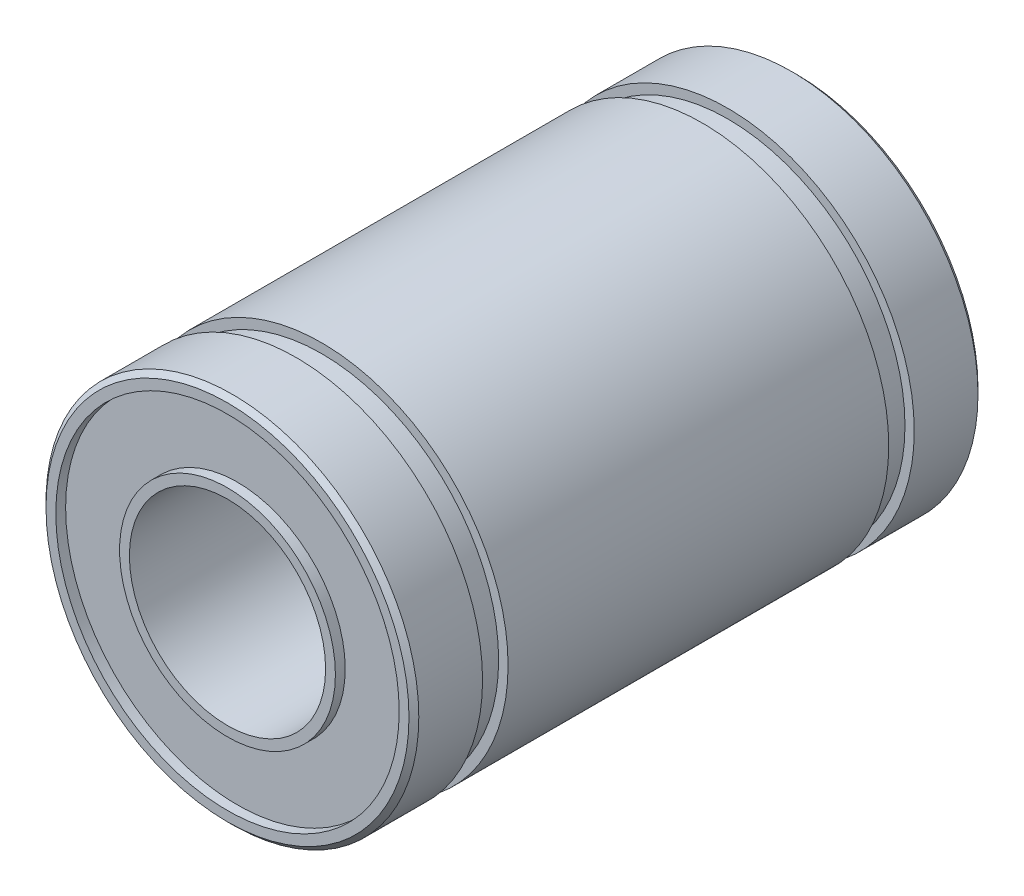
ISO-10303-21;
HEADER;
FILE_DESCRIPTION(('STEP AP214'),'2;1');
FILE_NAME('part.step','',(''),(''),'','','');
FILE_SCHEMA(('AUTOMOTIVE_DESIGN { 1 0 10303 214 1 1 1 1 }'));
ENDSEC;
DATA;
#1=APPLICATION_CONTEXT('core data for automotive mechanical design processes');
#2=APPLICATION_PROTOCOL_DEFINITION('international standard','automotive_design',2000,#1);
#3=PRODUCT_CONTEXT('',#1,'mechanical');
#4=PRODUCT('Part','Part','',(#3));
#5=PRODUCT_RELATED_PRODUCT_CATEGORY('part','',(#4));
#6=PRODUCT_DEFINITION_FORMATION('','',#4);
#7=PRODUCT_DEFINITION_CONTEXT('part definition',#1,'design');
#8=PRODUCT_DEFINITION('design','',#6,#7);
#9=PRODUCT_DEFINITION_SHAPE('','',#8);
#10=(LENGTH_UNIT() NAMED_UNIT(*) SI_UNIT(.MILLI.,.METRE.));
#11=(NAMED_UNIT(*) PLANE_ANGLE_UNIT() SI_UNIT($,.RADIAN.));
#12=(NAMED_UNIT(*) SI_UNIT($,.STERADIAN.) SOLID_ANGLE_UNIT());
#13=UNCERTAINTY_MEASURE_WITH_UNIT(LENGTH_MEASURE(1.E-05),#10,'distance_accuracy_value','');
#14=(GEOMETRIC_REPRESENTATION_CONTEXT(3) GLOBAL_UNCERTAINTY_ASSIGNED_CONTEXT((#13)) GLOBAL_UNIT_ASSIGNED_CONTEXT((#10,
#11,#12)) REPRESENTATION_CONTEXT('',''));
#15=CARTESIAN_POINT('',(0.,0.,0.));
#16=DIRECTION('',(0.,0.,1.));
#17=DIRECTION('',(1.,0.,0.));
#18=AXIS2_PLACEMENT_3D('',#15,#16,#17);
#19=CARTESIAN_POINT('',(0.,0.,-11.));
#20=DIRECTION('',(0.,0.,1.));
#21=DIRECTION('',(1.,0.,0.));
#22=AXIS2_PLACEMENT_3D('',#19,#20,#21);
#23=CYLINDRICAL_SURFACE('',#22,9.02874085293023);
#24=CARTESIAN_POINT('',(0.,0.,-9.7));
#25=DIRECTION('',(0.,0.,-1.));
#26=DIRECTION('',(1.,0.,0.));
#27=AXIS2_PLACEMENT_3D('',#24,#25,#26);
#28=CIRCLE('',#27,9.02874085293023);
#29=CARTESIAN_POINT('',(-9.02874085293023,0.,-9.7));
#30=VERTEX_POINT('',#29);
#31=EDGE_CURVE('E11',#30,#30,#28,.T.);
#32=ORIENTED_EDGE('',*,*,#31,.T.);
#33=EDGE_LOOP('',(#32));
#34=FACE_BOUND('',#33,.T.);
#35=CARTESIAN_POINT('',(0.,0.,-11.));
#36=DIRECTION('',(0.,0.,1.));
#37=DIRECTION('',(1.,0.,0.));
#38=AXIS2_PLACEMENT_3D('',#35,#36,#37);
#39=CIRCLE('',#38,9.02874085293023);
#40=CARTESIAN_POINT('',(-9.02874085293023,0.,-11.));
#41=VERTEX_POINT('',#40);
#42=EDGE_CURVE('E28',#41,#41,#39,.T.);
#43=ORIENTED_EDGE('',*,*,#42,.T.);
#44=EDGE_LOOP('',(#43));
#45=FACE_BOUND('',#44,.T.);
#46=ADVANCED_FACE('F17',(#34,#45),#23,.T.);
#47=CARTESIAN_POINT('',(0.,0.,-9.7));
#48=DIRECTION('',(0.,0.,1.));
#49=DIRECTION('',(1.,0.,0.));
#50=AXIS2_PLACEMENT_3D('',#47,#48,#49);
#51=PLANE('',#50);
#52=CARTESIAN_POINT('',(0.,0.,-9.7));
#53=DIRECTION('',(0.,0.,1.));
#54=DIRECTION('',(-1.,0.,0.));
#55=AXIS2_PLACEMENT_3D('',#52,#53,#54);
#56=CIRCLE('',#55,9.5);
#57=CARTESIAN_POINT('',(9.5,0.,-9.7));
#58=VERTEX_POINT('',#57);
#59=EDGE_CURVE('E194',#58,#58,#56,.T.);
#60=ORIENTED_EDGE('',*,*,#59,.F.);
#61=EDGE_LOOP('',(#60));
#62=FACE_BOUND('',#61,.T.);
#63=ORIENTED_EDGE('',*,*,#31,.F.);
#64=EDGE_LOOP('',(#63));
#65=FACE_BOUND('',#64,.T.);
#66=ADVANCED_FACE('F242',(#62,#65),#51,.F.);
#67=CARTESIAN_POINT('',(0.,0.,-11.));
#68=DIRECTION('',(0.,0.,1.));
#69=DIRECTION('',(1.,0.,0.));
#70=AXIS2_PLACEMENT_3D('',#67,#68,#69);
#71=PLANE('',#70);
#72=CARTESIAN_POINT('',(0.,0.,-11.));
#73=DIRECTION('',(0.,0.,-1.));
#74=DIRECTION('',(-1.,0.,0.));
#75=AXIS2_PLACEMENT_3D('',#72,#73,#74);
#76=CIRCLE('',#75,9.5);
#77=CARTESIAN_POINT('',(9.5,0.,-11.));
#78=VERTEX_POINT('',#77);
#79=EDGE_CURVE('E221',#78,#78,#76,.T.);
#80=ORIENTED_EDGE('',*,*,#79,.F.);
#81=EDGE_LOOP('',(#80));
#82=FACE_BOUND('',#81,.T.);
#83=ORIENTED_EDGE('',*,*,#42,.F.);
#84=EDGE_LOOP('',(#83));
#85=FACE_BOUND('',#84,.T.);
#86=ADVANCED_FACE('F244',(#82,#85),#71,.T.);
#87=CARTESIAN_POINT('',(0.,0.,0.));
#88=DIRECTION('',(0.,0.,1.));
#89=DIRECTION('',(-1.,0.,0.));
#90=AXIS2_PLACEMENT_3D('',#87,#88,#89);
#91=CYLINDRICAL_SURFACE('',#90,9.5);
#92=CARTESIAN_POINT('',(0.,0.,-14.25));
#93=DIRECTION('',(0.,0.,-1.));
#94=DIRECTION('',(-1.,0.,0.));
#95=AXIS2_PLACEMENT_3D('',#92,#93,#94);
#96=CIRCLE('',#95,9.5);
#97=CARTESIAN_POINT('',(9.5,0.,-14.25));
#98=VERTEX_POINT('',#97);
#99=EDGE_CURVE('E193',#98,#98,#96,.T.);
#100=ORIENTED_EDGE('',*,*,#99,.F.);
#101=EDGE_LOOP('',(#100));
#102=FACE_BOUND('',#101,.T.);
#103=ORIENTED_EDGE('',*,*,#79,.T.);
#104=EDGE_LOOP('',(#103));
#105=FACE_BOUND('',#104,.T.);
#106=ADVANCED_FACE('F251',(#102,#105),#91,.T.);
#107=CARTESIAN_POINT('',(0.,0.,11.));
#108=DIRECTION('',(0.,0.,-1.));
#109=DIRECTION('',(-1.,0.,0.));
#110=AXIS2_PLACEMENT_3D('',#107,#108,#109);
#111=CYLINDRICAL_SURFACE('',#110,9.01887523714883);
#112=CARTESIAN_POINT('',(0.,0.,9.7));
#113=DIRECTION('',(0.,0.,1.));
#114=DIRECTION('',(-1.,0.,0.));
#115=AXIS2_PLACEMENT_3D('',#112,#113,#114);
#116=CIRCLE('',#115,9.01887523714883);
#117=CARTESIAN_POINT('',(9.01887523714883,0.,9.7));
#118=VERTEX_POINT('',#117);
#119=EDGE_CURVE('E209',#118,#118,#116,.T.);
#120=ORIENTED_EDGE('',*,*,#119,.T.);
#121=EDGE_LOOP('',(#120));
#122=FACE_BOUND('',#121,.T.);
#123=CARTESIAN_POINT('',(0.,0.,11.));
#124=DIRECTION('',(0.,0.,-1.));
#125=DIRECTION('',(-1.,0.,0.));
#126=AXIS2_PLACEMENT_3D('',#123,#124,#125);
#127=CIRCLE('',#126,9.01887523714883);
#128=CARTESIAN_POINT('',(9.01887523714883,0.,11.));
#129=VERTEX_POINT('',#128);
#130=EDGE_CURVE('E199',#129,#129,#127,.T.);
#131=ORIENTED_EDGE('',*,*,#130,.T.);
#132=EDGE_LOOP('',(#131));
#133=FACE_BOUND('',#132,.T.);
#134=ADVANCED_FACE('F267',(#122,#133),#111,.T.);
#135=CARTESIAN_POINT('',(0.,0.,9.7));
#136=DIRECTION('',(0.,0.,1.));
#137=DIRECTION('',(1.,0.,0.));
#138=AXIS2_PLACEMENT_3D('',#135,#136,#137);
#139=PLANE('',#138);
#140=CARTESIAN_POINT('',(0.,0.,9.7));
#141=DIRECTION('',(0.,0.,-1.));
#142=DIRECTION('',(-1.,0.,0.));
#143=AXIS2_PLACEMENT_3D('',#140,#141,#142);
#144=CIRCLE('',#143,9.5);
#145=CARTESIAN_POINT('',(9.5,0.,9.7));
#146=VERTEX_POINT('',#145);
#147=EDGE_CURVE('E213',#146,#146,#144,.T.);
#148=ORIENTED_EDGE('',*,*,#147,.F.);
#149=EDGE_LOOP('',(#148));
#150=FACE_BOUND('',#149,.T.);
#151=ORIENTED_EDGE('',*,*,#119,.F.);
#152=EDGE_LOOP('',(#151));
#153=FACE_BOUND('',#152,.T.);
#154=ADVANCED_FACE('F271',(#150,#153),#139,.T.);
#155=CARTESIAN_POINT('',(0.,0.,11.));
#156=DIRECTION('',(0.,0.,1.));
#157=DIRECTION('',(1.,0.,0.));
#158=AXIS2_PLACEMENT_3D('',#155,#156,#157);
#159=PLANE('',#158);
#160=CARTESIAN_POINT('',(0.,0.,11.));
#161=DIRECTION('',(0.,0.,1.));
#162=DIRECTION('',(-1.,0.,0.));
#163=AXIS2_PLACEMENT_3D('',#160,#161,#162);
#164=CIRCLE('',#163,9.5);
#165=CARTESIAN_POINT('',(9.5,0.,11.));
#166=VERTEX_POINT('',#165);
#167=EDGE_CURVE('E195',#166,#166,#164,.T.);
#168=ORIENTED_EDGE('',*,*,#167,.F.);
#169=EDGE_LOOP('',(#168));
#170=FACE_BOUND('',#169,.T.);
#171=ORIENTED_EDGE('',*,*,#130,.F.);
#172=EDGE_LOOP('',(#171));
#173=FACE_BOUND('',#172,.T.);
#174=ADVANCED_FACE('F275',(#170,#173),#159,.F.);
#175=CARTESIAN_POINT('',(0.,0.,0.));
#176=DIRECTION('',(0.,0.,1.));
#177=DIRECTION('',(-1.,0.,0.));
#178=AXIS2_PLACEMENT_3D('',#175,#176,#177);
#179=CYLINDRICAL_SURFACE('',#178,9.5);
#180=CARTESIAN_POINT('',(0.,0.,14.25));
#181=DIRECTION('',(0.,0.,1.));
#182=DIRECTION('',(-1.,0.,0.));
#183=AXIS2_PLACEMENT_3D('',#180,#181,#182);
#184=CIRCLE('',#183,9.5);
#185=CARTESIAN_POINT('',(9.5,0.,14.25));
#186=VERTEX_POINT('',#185);
#187=EDGE_CURVE('E188',#186,#186,#184,.T.);
#188=ORIENTED_EDGE('',*,*,#187,.F.);
#189=EDGE_LOOP('',(#188));
#190=FACE_BOUND('',#189,.T.);
#191=ORIENTED_EDGE('',*,*,#167,.T.);
#192=EDGE_LOOP('',(#191));
#193=FACE_BOUND('',#192,.T.);
#194=ADVANCED_FACE('F262',(#190,#193),#179,.T.);
#195=CARTESIAN_POINT('',(0.,0.,-14.375));
#196=DIRECTION('',(0.,0.,1.));
#197=DIRECTION('',(-1.,0.,0.));
#198=AXIS2_PLACEMENT_3D('',#195,#196,#197);
#199=CONICAL_SURFACE('',#198,9.375,0.785398163400002);
#200=ORIENTED_EDGE('',*,*,#99,.T.);
#201=EDGE_LOOP('',(#200));
#202=FACE_BOUND('',#201,.T.);
#203=CARTESIAN_POINT('',(0.,0.,-14.5));
#204=DIRECTION('',(0.,0.,1.));
#205=DIRECTION('',(-1.,0.,0.));
#206=AXIS2_PLACEMENT_3D('',#203,#204,#205);
#207=CIRCLE('',#206,9.25);
#208=CARTESIAN_POINT('',(9.25,0.,-14.5));
#209=VERTEX_POINT('',#208);
#210=EDGE_CURVE('E189',#209,#209,#207,.T.);
#211=ORIENTED_EDGE('',*,*,#210,.T.);
#212=EDGE_LOOP('',(#211));
#213=FACE_BOUND('',#212,.T.);
#214=ADVANCED_FACE('F260',(#202,#213),#199,.T.);
#215=CARTESIAN_POINT('',(0.,0.,0.));
#216=DIRECTION('',(0.,0.,1.));
#217=DIRECTION('',(-1.,0.,0.));
#218=AXIS2_PLACEMENT_3D('',#215,#216,#217);
#219=CYLINDRICAL_SURFACE('',#218,9.5);
#220=ORIENTED_EDGE('',*,*,#59,.T.);
#221=EDGE_LOOP('',(#220));
#222=FACE_BOUND('',#221,.T.);
#223=ORIENTED_EDGE('',*,*,#147,.T.);
#224=EDGE_LOOP('',(#223));
#225=FACE_BOUND('',#224,.T.);
#226=ADVANCED_FACE('F239',(#222,#225),#219,.T.);
#227=CARTESIAN_POINT('',(0.,0.,-14.5));
#228=DIRECTION('',(0.,0.,1.));
#229=DIRECTION('',(1.,0.,0.));
#230=AXIS2_PLACEMENT_3D('',#227,#228,#229);
#231=PLANE('',#230);
#232=ORIENTED_EDGE('',*,*,#210,.F.);
#233=EDGE_LOOP('',(#232));
#234=FACE_BOUND('',#233,.T.);
#235=CARTESIAN_POINT('',(0.,0.,-14.5));
#236=DIRECTION('',(0.,0.,1.));
#237=DIRECTION('',(-1.,0.,0.));
#238=AXIS2_PLACEMENT_3D('',#235,#236,#237);
#239=CIRCLE('',#238,8.75);
#240=CARTESIAN_POINT('',(8.75,0.,-14.5));
#241=VERTEX_POINT('',#240);
#242=EDGE_CURVE('E217',#241,#241,#239,.T.);
#243=ORIENTED_EDGE('',*,*,#242,.T.);
#244=EDGE_LOOP('',(#243));
#245=FACE_BOUND('',#244,.T.);
#246=ADVANCED_FACE('F259',(#234,#245),#231,.F.);
#247=CARTESIAN_POINT('',(0.,0.,14.375));
#248=DIRECTION('',(0.,0.,-1.));
#249=DIRECTION('',(-1.,0.,0.));
#250=AXIS2_PLACEMENT_3D('',#247,#248,#249);
#251=CONICAL_SURFACE('',#250,9.375,0.785398163400002);
#252=ORIENTED_EDGE('',*,*,#187,.T.);
#253=EDGE_LOOP('',(#252));
#254=FACE_BOUND('',#253,.T.);
#255=CARTESIAN_POINT('',(0.,0.,14.5));
#256=DIRECTION('',(0.,0.,-1.));
#257=DIRECTION('',(-1.,0.,0.));
#258=AXIS2_PLACEMENT_3D('',#255,#256,#257);
#259=CIRCLE('',#258,9.25);
#260=CARTESIAN_POINT('',(9.25,0.,14.5));
#261=VERTEX_POINT('',#260);
#262=EDGE_CURVE('E183',#261,#261,#259,.T.);
#263=ORIENTED_EDGE('',*,*,#262,.T.);
#264=EDGE_LOOP('',(#263));
#265=FACE_BOUND('',#264,.T.);
#266=ADVANCED_FACE('F291',(#254,#265),#251,.T.);
#267=CARTESIAN_POINT('',(0.,0.,14.5));
#268=DIRECTION('',(0.,0.,1.));
#269=DIRECTION('',(1.,0.,0.));
#270=AXIS2_PLACEMENT_3D('',#267,#268,#269);
#271=PLANE('',#270);
#272=ORIENTED_EDGE('',*,*,#262,.F.);
#273=EDGE_LOOP('',(#272));
#274=FACE_BOUND('',#273,.T.);
#275=CARTESIAN_POINT('',(0.,0.,14.5));
#276=DIRECTION('',(0.,0.,-1.));
#277=DIRECTION('',(-1.,0.,0.));
#278=AXIS2_PLACEMENT_3D('',#275,#276,#277);
#279=CIRCLE('',#278,8.75);
#280=CARTESIAN_POINT('',(8.75,0.,14.5));
#281=VERTEX_POINT('',#280);
#282=EDGE_CURVE('E179',#281,#281,#279,.T.);
#283=ORIENTED_EDGE('',*,*,#282,.T.);
#284=EDGE_LOOP('',(#283));
#285=FACE_BOUND('',#284,.T.);
#286=ADVANCED_FACE('F287',(#274,#285),#271,.T.);
#287=CARTESIAN_POINT('',(0.,0.,0.));
#288=DIRECTION('',(0.,0.,1.));
#289=DIRECTION('',(-1.,0.,0.));
#290=AXIS2_PLACEMENT_3D('',#287,#288,#289);
#291=CYLINDRICAL_SURFACE('',#290,8.75);
#292=ORIENTED_EDGE('',*,*,#282,.F.);
#293=EDGE_LOOP('',(#292));
#294=FACE_BOUND('',#293,.T.);
#295=CARTESIAN_POINT('',(0.,0.,14.));
#296=DIRECTION('',(0.,0.,-1.));
#297=DIRECTION('',(-1.,0.,0.));
#298=AXIS2_PLACEMENT_3D('',#295,#296,#297);
#299=CIRCLE('',#298,8.75);
#300=CARTESIAN_POINT('',(8.75,0.,14.));
#301=VERTEX_POINT('',#300);
#302=EDGE_CURVE('E184',#301,#301,#299,.T.);
#303=ORIENTED_EDGE('',*,*,#302,.T.);
#304=EDGE_LOOP('',(#303));
#305=FACE_BOUND('',#304,.T.);
#306=ADVANCED_FACE('F283',(#294,#305),#291,.F.);
#307=CARTESIAN_POINT('',(0.,0.,14.5));
#308=DIRECTION('',(0.,0.,1.));
#309=DIRECTION('',(1.,0.,0.));
#310=AXIS2_PLACEMENT_3D('',#307,#308,#309);
#311=PLANE('',#310);
#312=CARTESIAN_POINT('',(0.,0.,14.5));
#313=DIRECTION('',(0.,0.,1.));
#314=DIRECTION('',(-1.,0.,0.));
#315=AXIS2_PLACEMENT_3D('',#312,#313,#314);
#316=CIRCLE('',#315,5.5);
#317=CARTESIAN_POINT('',(5.5,0.,14.5));
#318=VERTEX_POINT('',#317);
#319=EDGE_CURVE('E178',#318,#318,#316,.T.);
#320=ORIENTED_EDGE('',*,*,#319,.T.);
#321=EDGE_LOOP('',(#320));
#322=FACE_BOUND('',#321,.T.);
#323=CARTESIAN_POINT('',(0.,0.,14.5));
#324=DIRECTION('',(0.,0.,-1.));
#325=DIRECTION('',(-1.,0.,0.));
#326=AXIS2_PLACEMENT_3D('',#323,#324,#325);
#327=CIRCLE('',#326,5.);
#328=CARTESIAN_POINT('',(5.,0.,14.5));
#329=VERTEX_POINT('',#328);
#330=EDGE_CURVE('E174',#329,#329,#327,.T.);
#331=ORIENTED_EDGE('',*,*,#330,.T.);
#332=EDGE_LOOP('',(#331));
#333=FACE_BOUND('',#332,.T.);
#334=ADVANCED_FACE('F286',(#322,#333),#311,.T.);
#335=CARTESIAN_POINT('',(0.,0.,-14.5));
#336=DIRECTION('',(0.,0.,1.));
#337=DIRECTION('',(1.,0.,0.));
#338=AXIS2_PLACEMENT_3D('',#335,#336,#337);
#339=PLANE('',#338);
#340=CARTESIAN_POINT('',(0.,0.,-14.5));
#341=DIRECTION('',(0.,0.,-1.));
#342=DIRECTION('',(-1.,0.,0.));
#343=AXIS2_PLACEMENT_3D('',#340,#341,#342);
#344=CIRCLE('',#343,5.5);
#345=CARTESIAN_POINT('',(5.5,0.,-14.5));
#346=VERTEX_POINT('',#345);
#347=EDGE_CURVE('E170',#346,#346,#344,.T.);
#348=ORIENTED_EDGE('',*,*,#347,.T.);
#349=EDGE_LOOP('',(#348));
#350=FACE_BOUND('',#349,.T.);
#351=CARTESIAN_POINT('',(0.,0.,-14.5));
#352=DIRECTION('',(0.,0.,1.));
#353=DIRECTION('',(-1.,0.,0.));
#354=AXIS2_PLACEMENT_3D('',#351,#352,#353);
#355=CIRCLE('',#354,5.);
#356=CARTESIAN_POINT('',(5.,0.,-14.5));
#357=VERTEX_POINT('',#356);
#358=EDGE_CURVE('E166',#357,#357,#355,.T.);
#359=ORIENTED_EDGE('',*,*,#358,.T.);
#360=EDGE_LOOP('',(#359));
#361=FACE_BOUND('',#360,.T.);
#362=ADVANCED_FACE('F301',(#350,#361),#339,.F.);
#363=CARTESIAN_POINT('',(0.,0.,0.));
#364=DIRECTION('',(0.,0.,1.));
#365=DIRECTION('',(-1.,0.,0.));
#366=AXIS2_PLACEMENT_3D('',#363,#364,#365);
#367=CYLINDRICAL_SURFACE('',#366,5.);
#368=ORIENTED_EDGE('',*,*,#358,.F.);
#369=EDGE_LOOP('',(#368));
#370=FACE_BOUND('',#369,.T.);
#371=ORIENTED_EDGE('',*,*,#330,.F.);
#372=EDGE_LOOP('',(#371));
#373=FACE_BOUND('',#372,.T.);
#374=ADVANCED_FACE('F305',(#370,#373),#367,.F.);
#375=CARTESIAN_POINT('',(0.,0.,0.));
#376=DIRECTION('',(0.,0.,1.));
#377=DIRECTION('',(-1.,0.,0.));
#378=AXIS2_PLACEMENT_3D('',#375,#376,#377);
#379=CYLINDRICAL_SURFACE('',#378,5.5);
#380=ORIENTED_EDGE('',*,*,#319,.F.);
#381=EDGE_LOOP('',(#380));
#382=FACE_BOUND('',#381,.T.);
#383=CARTESIAN_POINT('',(0.,0.,14.));
#384=DIRECTION('',(0.,0.,1.));
#385=DIRECTION('',(-1.,0.,0.));
#386=AXIS2_PLACEMENT_3D('',#383,#384,#385);
#387=CIRCLE('',#386,5.5);
#388=CARTESIAN_POINT('',(5.5,0.,14.));
#389=VERTEX_POINT('',#388);
#390=EDGE_CURVE('E162',#389,#389,#387,.T.);
#391=ORIENTED_EDGE('',*,*,#390,.T.);
#392=EDGE_LOOP('',(#391));
#393=FACE_BOUND('',#392,.T.);
#394=ADVANCED_FACE('F309',(#382,#393),#379,.T.);
#395=CARTESIAN_POINT('',(0.,0.,14.));
#396=DIRECTION('',(0.,0.,1.));
#397=DIRECTION('',(1.,0.,0.));
#398=AXIS2_PLACEMENT_3D('',#395,#396,#397);
#399=PLANE('',#398);
#400=ORIENTED_EDGE('',*,*,#302,.F.);
#401=EDGE_LOOP('',(#400));
#402=FACE_BOUND('',#401,.T.);
#403=ORIENTED_EDGE('',*,*,#390,.F.);
#404=EDGE_LOOP('',(#403));
#405=FACE_BOUND('',#404,.T.);
#406=ADVANCED_FACE('F313',(#402,#405),#399,.T.);
#407=CARTESIAN_POINT('',(0.,0.,0.));
#408=DIRECTION('',(0.,0.,1.));
#409=DIRECTION('',(-1.,0.,0.));
#410=AXIS2_PLACEMENT_3D('',#407,#408,#409);
#411=CYLINDRICAL_SURFACE('',#410,8.75);
#412=ORIENTED_EDGE('',*,*,#242,.F.);
#413=EDGE_LOOP('',(#412));
#414=FACE_BOUND('',#413,.T.);
#415=CARTESIAN_POINT('',(0.,0.,-13.5));
#416=DIRECTION('',(0.,0.,1.));
#417=DIRECTION('',(-1.,0.,0.));
#418=AXIS2_PLACEMENT_3D('',#415,#416,#417);
#419=CIRCLE('',#418,8.75);
#420=CARTESIAN_POINT('',(-8.75,0.,-13.5));
#421=VERTEX_POINT('',#420);
#422=EDGE_CURVE('E158',#421,#421,#419,.T.);
#423=ORIENTED_EDGE('',*,*,#422,.T.);
#424=EDGE_LOOP('',(#423));
#425=FACE_BOUND('',#424,.T.);
#426=ADVANCED_FACE('F317',(#414,#425),#411,.F.);
#427=CARTESIAN_POINT('',(0.,0.,0.));
#428=DIRECTION('',(0.,0.,1.));
#429=DIRECTION('',(-1.,0.,0.));
#430=AXIS2_PLACEMENT_3D('',#427,#428,#429);
#431=CYLINDRICAL_SURFACE('',#430,5.5);
#432=ORIENTED_EDGE('',*,*,#347,.F.);
#433=EDGE_LOOP('',(#432));
#434=FACE_BOUND('',#433,.T.);
#435=CARTESIAN_POINT('',(0.,0.,-13.5));
#436=DIRECTION('',(0.,0.,-1.));
#437=DIRECTION('',(-1.,0.,0.));
#438=AXIS2_PLACEMENT_3D('',#435,#436,#437);
#439=CIRCLE('',#438,5.5);
#440=CARTESIAN_POINT('',(-5.5,0.,-13.5));
#441=VERTEX_POINT('',#440);
#442=EDGE_CURVE('E154',#441,#441,#439,.T.);
#443=ORIENTED_EDGE('',*,*,#442,.T.);
#444=EDGE_LOOP('',(#443));
#445=FACE_BOUND('',#444,.T.);
#446=ADVANCED_FACE('F321',(#434,#445),#431,.T.);
#447=CARTESIAN_POINT('',(0.,0.,-13.5));
#448=DIRECTION('',(0.,0.,1.));
#449=DIRECTION('',(1.,0.,0.));
#450=AXIS2_PLACEMENT_3D('',#447,#448,#449);
#451=PLANE('',#450);
#452=ORIENTED_EDGE('',*,*,#422,.F.);
#453=EDGE_LOOP('',(#452));
#454=FACE_BOUND('',#453,.T.);
#455=ORIENTED_EDGE('',*,*,#442,.F.);
#456=EDGE_LOOP('',(#455));
#457=FACE_BOUND('',#456,.T.);
#458=ADVANCED_FACE('F325',(#454,#457),#451,.F.);
#459=CLOSED_SHELL('',(#46,#66,#86,#106,#134,#154,#174,#194,#214,#226,#246,#266,#286,#306,#334,
#362,#374,#394,#406,#426,#446,#458));
#460=CARTESIAN_POINT('',(0.,0.,0.));
#461=DIRECTION('',(0.,0.,1.));
#462=DIRECTION('',(-1.,0.,0.));
#463=AXIS2_PLACEMENT_3D('',#460,#461,#462);
#464=CYLINDRICAL_SURFACE('',#463,8.75);
#465=CARTESIAN_POINT('',(0.,0.,-12.5));
#466=DIRECTION('',(0.,0.,-1.));
#467=DIRECTION('',(-1.,0.,0.));
#468=AXIS2_PLACEMENT_3D('',#465,#466,#467);
#469=CIRCLE('',#468,8.75);
#470=CARTESIAN_POINT('',(-8.75,0.,-12.5));
#471=VERTEX_POINT('',#470);
#472=EDGE_CURVE('E149',#471,#471,#469,.T.);
#473=ORIENTED_EDGE('',*,*,#472,.T.);
#474=EDGE_LOOP('',(#473));
#475=FACE_BOUND('',#474,.T.);
#476=CARTESIAN_POINT('',(0.,0.,13.));
#477=DIRECTION('',(0.,0.,1.));
#478=DIRECTION('',(-1.,0.,0.));
#479=AXIS2_PLACEMENT_3D('',#476,#477,#478);
#480=CIRCLE('',#479,8.75);
#481=CARTESIAN_POINT('',(8.75,0.,13.));
#482=VERTEX_POINT('',#481);
#483=EDGE_CURVE('E132',#482,#482,#480,.T.);
#484=ORIENTED_EDGE('',*,*,#483,.T.);
#485=EDGE_LOOP('',(#484));
#486=FACE_BOUND('',#485,.T.);
#487=ADVANCED_FACE('F19',(#475,#486),#464,.F.);
#488=CARTESIAN_POINT('',(0.,0.,0.));
#489=DIRECTION('',(0.,0.,1.));
#490=DIRECTION('',(-1.,0.,0.));
#491=AXIS2_PLACEMENT_3D('',#488,#489,#490);
#492=CYLINDRICAL_SURFACE('',#491,5.5);
#493=CARTESIAN_POINT('',(0.,0.,-12.5));
#494=DIRECTION('',(0.,0.,1.));
#495=DIRECTION('',(-1.,0.,0.));
#496=AXIS2_PLACEMENT_3D('',#493,#494,#495);
#497=CIRCLE('',#496,5.5);
#498=CARTESIAN_POINT('',(-5.5,0.,-12.5));
#499=VERTEX_POINT('',#498);
#500=EDGE_CURVE('E145',#499,#499,#497,.T.);
#501=ORIENTED_EDGE('',*,*,#500,.T.);
#502=EDGE_LOOP('',(#501));
#503=FACE_BOUND('',#502,.T.);
#504=CARTESIAN_POINT('',(0.,0.,13.));
#505=DIRECTION('',(0.,0.,-1.));
#506=DIRECTION('',(-1.,0.,0.));
#507=AXIS2_PLACEMENT_3D('',#504,#505,#506);
#508=CIRCLE('',#507,5.5);
#509=CARTESIAN_POINT('',(5.5,0.,13.));
#510=VERTEX_POINT('',#509);
#511=EDGE_CURVE('E21',#510,#510,#508,.T.);
#512=ORIENTED_EDGE('',*,*,#511,.T.);
#513=EDGE_LOOP('',(#512));
#514=FACE_BOUND('',#513,.T.);
#515=ADVANCED_FACE('F138',(#503,#514),#492,.T.);
#516=CARTESIAN_POINT('',(0.,0.,13.));
#517=DIRECTION('',(0.,0.,1.));
#518=DIRECTION('',(1.,0.,0.));
#519=AXIS2_PLACEMENT_3D('',#516,#517,#518);
#520=PLANE('',#519);
#521=ORIENTED_EDGE('',*,*,#483,.F.);
#522=EDGE_LOOP('',(#521));
#523=FACE_BOUND('',#522,.T.);
#524=ORIENTED_EDGE('',*,*,#511,.F.);
#525=EDGE_LOOP('',(#524));
#526=FACE_BOUND('',#525,.T.);
#527=ADVANCED_FACE('F333',(#523,#526),#520,.F.);
#528=CARTESIAN_POINT('',(0.,0.,-12.5));
#529=DIRECTION('',(0.,0.,1.));
#530=DIRECTION('',(1.,0.,0.));
#531=AXIS2_PLACEMENT_3D('',#528,#529,#530);
#532=PLANE('',#531);
#533=ORIENTED_EDGE('',*,*,#472,.F.);
#534=EDGE_LOOP('',(#533));
#535=FACE_BOUND('',#534,.T.);
#536=ORIENTED_EDGE('',*,*,#500,.F.);
#537=EDGE_LOOP('',(#536));
#538=FACE_BOUND('',#537,.T.);
#539=ADVANCED_FACE('F330',(#535,#538),#532,.T.);
#540=CLOSED_SHELL('',(#487,#515,#527,#539));
#541=ORIENTED_CLOSED_SHELL('',*,#540,.T.);
#542=BREP_WITH_VOIDS('B1',#459,(#541));
#543=ADVANCED_BREP_SHAPE_REPRESENTATION('',(#18,#542),#14);
#544=SHAPE_DEFINITION_REPRESENTATION(#9,#543);
ENDSEC;
END-ISO-10303-21;
